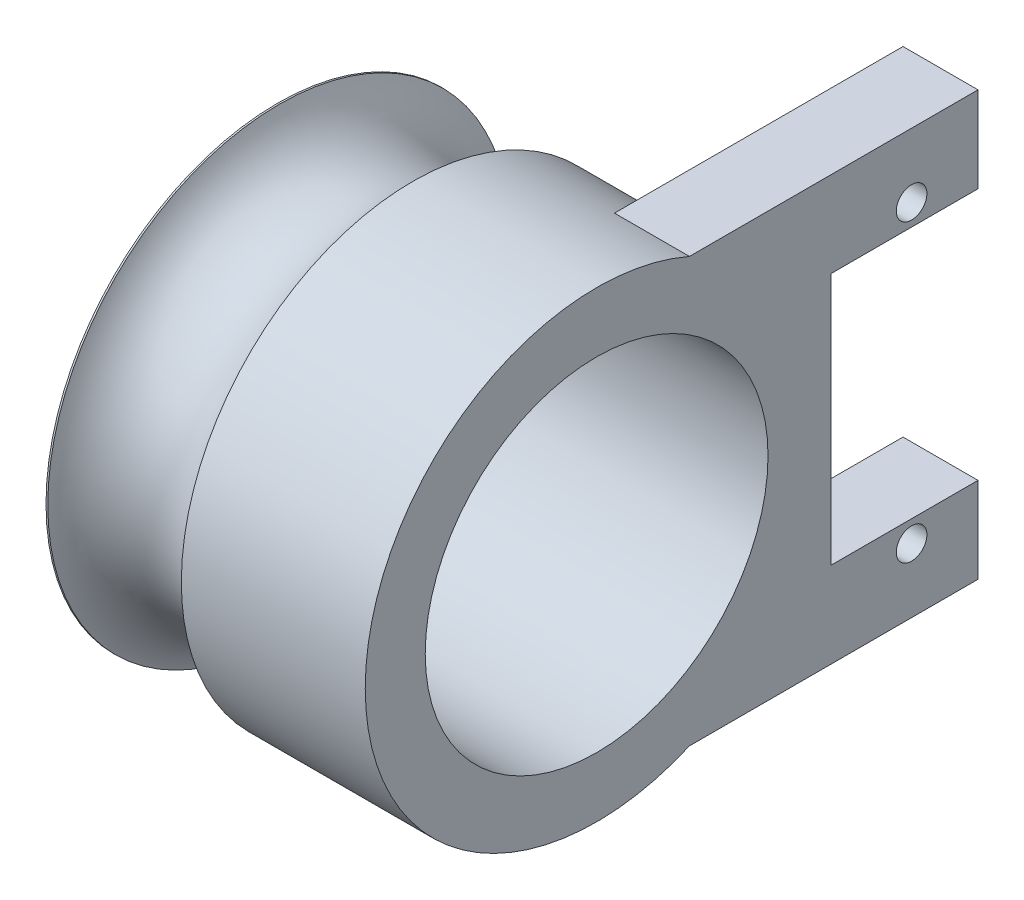
ISO-10303-21;
HEADER;
FILE_DESCRIPTION(('STEP AP214'),'2;1');
FILE_NAME('part.step','',(''),(''),'','','');
FILE_SCHEMA(('AUTOMOTIVE_DESIGN { 1 0 10303 214 1 1 1 1 }'));
ENDSEC;
DATA;
#1=APPLICATION_CONTEXT('core data for automotive mechanical design processes');
#2=APPLICATION_PROTOCOL_DEFINITION('international standard','automotive_design',2000,#1);
#3=PRODUCT_CONTEXT('',#1,'mechanical');
#4=PRODUCT('Part','Part','',(#3));
#5=PRODUCT_RELATED_PRODUCT_CATEGORY('part','',(#4));
#6=PRODUCT_DEFINITION_FORMATION('','',#4);
#7=PRODUCT_DEFINITION_CONTEXT('part definition',#1,'design');
#8=PRODUCT_DEFINITION('design','',#6,#7);
#9=PRODUCT_DEFINITION_SHAPE('','',#8);
#10=(LENGTH_UNIT() NAMED_UNIT(*) SI_UNIT(.MILLI.,.METRE.));
#11=(NAMED_UNIT(*) PLANE_ANGLE_UNIT() SI_UNIT($,.RADIAN.));
#12=(NAMED_UNIT(*) SI_UNIT($,.STERADIAN.) SOLID_ANGLE_UNIT());
#13=UNCERTAINTY_MEASURE_WITH_UNIT(LENGTH_MEASURE(1.E-05),#10,'distance_accuracy_value','');
#14=(GEOMETRIC_REPRESENTATION_CONTEXT(3) GLOBAL_UNCERTAINTY_ASSIGNED_CONTEXT((#13)) GLOBAL_UNIT_ASSIGNED_CONTEXT((#10,
#11,#12)) REPRESENTATION_CONTEXT('',''));
#15=CARTESIAN_POINT('',(0.,0.,0.));
#16=DIRECTION('',(0.,0.,1.));
#17=DIRECTION('',(1.,0.,0.));
#18=AXIS2_PLACEMENT_3D('',#15,#16,#17);
#19=CARTESIAN_POINT('',(-6.4,21.6,0.));
#20=DIRECTION('',(-1.,0.,0.));
#21=DIRECTION('',(0.,0.,1.));
#22=AXIS2_PLACEMENT_3D('',#19,#20,#21);
#23=PLANE('',#22);
#24=CARTESIAN_POINT('',(-6.4,0.,0.));
#25=DIRECTION('',(1.,0.,0.));
#26=DIRECTION('',(0.,0.,-1.));
#27=AXIS2_PLACEMENT_3D('',#24,#25,#26);
#28=CIRCLE('',#27,16.);
#29=CARTESIAN_POINT('',(-6.4,16.,0.));
#30=VERTEX_POINT('',#29);
#31=CARTESIAN_POINT('',(-6.4,-16.,0.));
#32=VERTEX_POINT('',#31);
#33=EDGE_CURVE('E53',#30,#32,#28,.T.);
#34=ORIENTED_EDGE('',*,*,#33,.T.);
#35=CARTESIAN_POINT('',(-6.4,0.,0.));
#36=DIRECTION('',(1.,0.,0.));
#37=DIRECTION('',(0.,0.,-1.));
#38=AXIS2_PLACEMENT_3D('',#35,#36,#37);
#39=CIRCLE('',#38,16.);
#40=EDGE_CURVE('E11',#32,#30,#39,.T.);
#41=ORIENTED_EDGE('',*,*,#40,.T.);
#42=EDGE_LOOP('',(#34,#41));
#43=FACE_BOUND('',#42,.T.);
#44=CARTESIAN_POINT('',(-6.4,0.,0.));
#45=DIRECTION('',(1.,0.,0.));
#46=DIRECTION('',(0.,0.,-1.));
#47=AXIS2_PLACEMENT_3D('',#44,#45,#46);
#48=CIRCLE('',#47,21.6);
#49=CARTESIAN_POINT('',(-6.4,21.6,0.));
#50=VERTEX_POINT('',#49);
#51=CARTESIAN_POINT('',(-6.4,-21.6,0.));
#52=VERTEX_POINT('',#51);
#53=EDGE_CURVE('E186',#50,#52,#48,.T.);
#54=ORIENTED_EDGE('',*,*,#53,.F.);
#55=CARTESIAN_POINT('',(-6.4,0.,0.));
#56=DIRECTION('',(1.,0.,0.));
#57=DIRECTION('',(0.,0.,-1.));
#58=AXIS2_PLACEMENT_3D('',#55,#56,#57);
#59=CIRCLE('',#58,21.6);
#60=EDGE_CURVE('E182',#52,#50,#59,.T.);
#61=ORIENTED_EDGE('',*,*,#60,.F.);
#62=EDGE_LOOP('',(#54,#61));
#63=FACE_BOUND('',#62,.T.);
#64=ADVANCED_FACE('F44',(#43,#63),#23,.T.);
#65=CARTESIAN_POINT('',(0.,0.,0.));
#66=DIRECTION('',(1.,0.,0.));
#67=DIRECTION('',(0.,1.,0.));
#68=AXIS2_PLACEMENT_3D('',#65,#66,#67);
#69=CYLINDRICAL_SURFACE('',#68,16.);
#70=DIRECTION('',(-1.,0.,0.));
#71=VECTOR('',#70,1.);
#72=CARTESIAN_POINT('',(0.,-16.,0.));
#73=LINE('',#72,#71);
#74=CARTESIAN_POINT('',(6.4,-16.,0.));
#75=VERTEX_POINT('',#74);
#76=EDGE_CURVE('E181',#75,#32,#73,.T.);
#77=ORIENTED_EDGE('',*,*,#76,.F.);
#78=ORIENTED_EDGE('',*,*,#76,.T.);
#79=ORIENTED_EDGE('',*,*,#33,.F.);
#80=ORIENTED_EDGE('',*,*,#40,.F.);
#81=EDGE_LOOP('',(#77,#78,#79,#80));
#82=FACE_BOUND('',#81,.T.);
#83=CARTESIAN_POINT('',(23.4,0.,0.));
#84=DIRECTION('',(1.,0.,0.));
#85=DIRECTION('',(0.,0.,-1.));
#86=AXIS2_PLACEMENT_3D('',#83,#84,#85);
#87=CIRCLE('',#86,16.);
#88=CARTESIAN_POINT('',(23.4,0.,-16.));
#89=VERTEX_POINT('',#88);
#90=EDGE_CURVE('E294',#89,#89,#87,.T.);
#91=ORIENTED_EDGE('',*,*,#90,.T.);
#92=EDGE_LOOP('',(#91));
#93=FACE_BOUND('',#92,.T.);
#94=ADVANCED_FACE('F220',(#82,#93),#69,.F.);
#95=CARTESIAN_POINT('',(4.8,0.,0.));
#96=DIRECTION('',(1.,0.,0.));
#97=DIRECTION('',(0.,1.,0.));
#98=AXIS2_PLACEMENT_3D('',#95,#96,#97);
#99=CYLINDRICAL_SURFACE('',#98,21.6);
#100=DIRECTION('',(-1.,0.,0.));
#101=VECTOR('',#100,1.);
#102=CARTESIAN_POINT('',(4.8,-21.6,0.));
#103=LINE('',#102,#101);
#104=CARTESIAN_POINT('',(6.4,-21.6,0.));
#105=VERTEX_POINT('',#104);
#106=CARTESIAN_POINT('',(6.23397144683869,-21.6,0.));
#107=VERTEX_POINT('',#106);
#108=EDGE_CURVE('E211',#105,#107,#103,.T.);
#109=ORIENTED_EDGE('',*,*,#108,.F.);
#110=ORIENTED_EDGE('',*,*,#108,.T.);
#111=CARTESIAN_POINT('',(6.23397144683869,0.,0.));
#112=DIRECTION('',(1.,0.,0.));
#113=DIRECTION('',(0.,1.,0.));
#114=AXIS2_PLACEMENT_3D('',#111,#112,#113);
#115=CIRCLE('',#114,21.6);
#116=CARTESIAN_POINT('',(6.23397144683869,0.,-21.6));
#117=VERTEX_POINT('',#116);
#118=EDGE_CURVE('E196',#107,#117,#115,.T.);
#119=ORIENTED_EDGE('',*,*,#118,.T.);
#120=CARTESIAN_POINT('',(6.23397144683869,0.,0.));
#121=DIRECTION('',(1.,0.,0.));
#122=DIRECTION('',(0.,1.,0.));
#123=AXIS2_PLACEMENT_3D('',#120,#121,#122);
#124=CIRCLE('',#123,21.6);
#125=EDGE_CURVE('E203',#117,#107,#124,.T.);
#126=ORIENTED_EDGE('',*,*,#125,.T.);
#127=EDGE_LOOP('',(#109,#110,#119,#126));
#128=FACE_BOUND('',#127,.T.);
#129=CARTESIAN_POINT('',(16.4,0.,0.));
#130=DIRECTION('',(1.,0.,0.));
#131=DIRECTION('',(0.,0.,-1.));
#132=AXIS2_PLACEMENT_3D('',#129,#130,#131);
#133=CIRCLE('',#132,21.6);
#134=CARTESIAN_POINT('',(16.4,-19.785999201822,-8.66453897131854));
#135=VERTEX_POINT('',#134);
#136=CARTESIAN_POINT('',(16.4,19.785999201822,-8.66453897131854));
#137=VERTEX_POINT('',#136);
#138=EDGE_CURVE('E61',#135,#137,#133,.T.);
#139=ORIENTED_EDGE('',*,*,#138,.F.);
#140=DIRECTION('',(-1.,0.,0.));
#141=VECTOR('',#140,1.);
#142=CARTESIAN_POINT('',(23.4,-19.785999201822,-8.66453897131854));
#143=LINE('',#142,#141);
#144=CARTESIAN_POINT('',(23.4,-19.785999201822,-8.66453897131854));
#145=VERTEX_POINT('',#144);
#146=EDGE_CURVE('E155',#145,#135,#143,.T.);
#147=ORIENTED_EDGE('',*,*,#146,.F.);
#148=CARTESIAN_POINT('',(23.4,0.,0.));
#149=DIRECTION('',(1.,0.,0.));
#150=DIRECTION('',(0.,0.,-1.));
#151=AXIS2_PLACEMENT_3D('',#148,#149,#150);
#152=CIRCLE('',#151,21.6);
#153=CARTESIAN_POINT('',(23.4,19.785999201822,-8.66453897131854));
#154=VERTEX_POINT('',#153);
#155=EDGE_CURVE('E161',#154,#145,#152,.T.);
#156=ORIENTED_EDGE('',*,*,#155,.F.);
#157=DIRECTION('',(-1.,0.,0.));
#158=VECTOR('',#157,1.);
#159=CARTESIAN_POINT('',(23.4,19.785999201822,-8.66453897131854));
#160=LINE('',#159,#158);
#161=EDGE_CURVE('E317',#154,#137,#160,.T.);
#162=ORIENTED_EDGE('',*,*,#161,.T.);
#163=EDGE_LOOP('',(#139,#147,#156,#162));
#164=FACE_BOUND('',#163,.T.);
#165=ADVANCED_FACE('F171',(#128,#164),#99,.T.);
#166=CARTESIAN_POINT('',(-4.8,0.,0.));
#167=DIRECTION('',(1.,0.,0.));
#168=DIRECTION('',(0.,1.,0.));
#169=AXIS2_PLACEMENT_3D('',#166,#167,#168);
#170=CYLINDRICAL_SURFACE('',#169,21.6);
#171=CARTESIAN_POINT('',(-6.23397144683867,0.,0.));
#172=DIRECTION('',(-1.,0.,0.));
#173=DIRECTION('',(0.,1.,0.));
#174=AXIS2_PLACEMENT_3D('',#171,#172,#173);
#175=CIRCLE('',#174,21.6);
#176=CARTESIAN_POINT('',(-6.23397144683867,-21.6,0.));
#177=VERTEX_POINT('',#176);
#178=CARTESIAN_POINT('',(-6.23397144683867,0.,-21.6));
#179=VERTEX_POINT('',#178);
#180=EDGE_CURVE('E173',#177,#179,#175,.T.);
#181=ORIENTED_EDGE('',*,*,#180,.T.);
#182=CARTESIAN_POINT('',(-6.23397144683867,0.,0.));
#183=DIRECTION('',(-1.,0.,0.));
#184=DIRECTION('',(0.,1.,0.));
#185=AXIS2_PLACEMENT_3D('',#182,#183,#184);
#186=CIRCLE('',#185,21.6);
#187=EDGE_CURVE('E191',#179,#177,#186,.T.);
#188=ORIENTED_EDGE('',*,*,#187,.T.);
#189=DIRECTION('',(-1.,0.,0.));
#190=VECTOR('',#189,1.);
#191=CARTESIAN_POINT('',(-4.8,-21.6,0.));
#192=LINE('',#191,#190);
#193=EDGE_CURVE('E187',#177,#52,#192,.T.);
#194=ORIENTED_EDGE('',*,*,#193,.T.);
#195=ORIENTED_EDGE('',*,*,#60,.T.);
#196=ORIENTED_EDGE('',*,*,#53,.T.);
#197=ORIENTED_EDGE('',*,*,#193,.F.);
#198=EDGE_LOOP('',(#181,#188,#194,#195,#196,#197));
#199=FACE_BOUND('',#198,.T.);
#200=ADVANCED_FACE('F226',(#199),#170,.T.);
#201=CARTESIAN_POINT('',(0.,0.,0.));
#202=DIRECTION('',(-1.,0.,0.));
#203=DIRECTION('',(0.,0.,1.));
#204=AXIS2_PLACEMENT_3D('',#201,#202,#203);
#205=TOROIDAL_SURFACE('',#204,24.,6.68);
#206=ORIENTED_EDGE('',*,*,#180,.F.);
#207=ORIENTED_EDGE('',*,*,#187,.F.);
#208=CARTESIAN_POINT('',(0.,0.,-24.));
#209=DIRECTION('',(0.,1.,0.));
#210=DIRECTION('',(0.,0.,-1.));
#211=AXIS2_PLACEMENT_3D('',#208,#209,#210);
#212=CIRCLE('',#211,6.68);
#213=EDGE_CURVE('E192',#179,#117,#212,.T.);
#214=ORIENTED_EDGE('',*,*,#213,.T.);
#215=ORIENTED_EDGE('',*,*,#118,.F.);
#216=ORIENTED_EDGE('',*,*,#125,.F.);
#217=ORIENTED_EDGE('',*,*,#213,.F.);
#218=EDGE_LOOP('',(#206,#207,#214,#215,#216,#217));
#219=FACE_BOUND('',#218,.T.);
#220=ADVANCED_FACE('F230',(#219),#205,.F.);
#221=CARTESIAN_POINT('',(16.4,0.,0.));
#222=DIRECTION('',(1.,0.,0.));
#223=DIRECTION('',(0.,0.,-1.));
#224=AXIS2_PLACEMENT_3D('',#221,#222,#223);
#225=PLANE('',#224);
#226=CARTESIAN_POINT('',(16.4,13.79,-29.4011110933735));
#227=DIRECTION('',(1.,0.,0.));
#228=DIRECTION('',(0.,0.,-1.));
#229=AXIS2_PLACEMENT_3D('',#226,#227,#228);
#230=CIRCLE('',#229,1.43);
#231=CARTESIAN_POINT('',(16.4,13.79,-30.8311110933735));
#232=VERTEX_POINT('',#231);
#233=EDGE_CURVE('E293',#232,#232,#230,.T.);
#234=ORIENTED_EDGE('',*,*,#233,.T.);
#235=EDGE_LOOP('',(#234));
#236=FACE_BOUND('',#235,.T.);
#237=CARTESIAN_POINT('',(16.4,-13.79,-29.4011110933735));
#238=DIRECTION('',(1.,0.,0.));
#239=DIRECTION('',(0.,0.,-1.));
#240=AXIS2_PLACEMENT_3D('',#237,#238,#239);
#241=CIRCLE('',#240,1.43);
#242=CARTESIAN_POINT('',(16.4,-13.79,-30.8311110933735));
#243=VERTEX_POINT('',#242);
#244=EDGE_CURVE('E296',#243,#243,#241,.T.);
#245=ORIENTED_EDGE('',*,*,#244,.T.);
#246=EDGE_LOOP('',(#245));
#247=FACE_BOUND('',#246,.T.);
#248=DIRECTION('',(0.,0.,-1.));
#249=VECTOR('',#248,1.);
#250=CARTESIAN_POINT('',(16.4,-19.785999201822,-35.6011110933735));
#251=LINE('',#250,#249);
#252=CARTESIAN_POINT('',(16.4,-19.785999201822,-35.6011110933735));
#253=VERTEX_POINT('',#252);
#254=EDGE_CURVE('E304',#135,#253,#251,.T.);
#255=ORIENTED_EDGE('',*,*,#254,.F.);
#256=ORIENTED_EDGE('',*,*,#138,.T.);
#257=DIRECTION('',(0.,0.,1.));
#258=VECTOR('',#257,1.);
#259=CARTESIAN_POINT('',(16.4,19.785999201822,-8.66453897131854));
#260=LINE('',#259,#258);
#261=CARTESIAN_POINT('',(16.4,19.785999201822,-35.6011110933735));
#262=VERTEX_POINT('',#261);
#263=EDGE_CURVE('E169',#262,#137,#260,.T.);
#264=ORIENTED_EDGE('',*,*,#263,.F.);
#265=DIRECTION('',(0.,1.,0.));
#266=VECTOR('',#265,1.);
#267=CARTESIAN_POINT('',(16.4,19.785999201822,-35.6011110933735));
#268=LINE('',#267,#266);
#269=CARTESIAN_POINT('',(16.4,11.785999201822,-35.6011110933735));
#270=VERTEX_POINT('',#269);
#271=EDGE_CURVE('E327',#270,#262,#268,.T.);
#272=ORIENTED_EDGE('',*,*,#271,.F.);
#273=DIRECTION('',(0.,0.,-1.));
#274=VECTOR('',#273,1.);
#275=CARTESIAN_POINT('',(16.4,11.785999201822,-35.6011110933735));
#276=LINE('',#275,#274);
#277=CARTESIAN_POINT('',(16.4,11.785999201822,-21.9011110933735));
#278=VERTEX_POINT('',#277);
#279=EDGE_CURVE('E325',#278,#270,#276,.T.);
#280=ORIENTED_EDGE('',*,*,#279,.F.);
#281=DIRECTION('',(0.,1.,0.));
#282=VECTOR('',#281,1.);
#283=CARTESIAN_POINT('',(16.4,-11.785999201822,-21.9011110933735));
#284=LINE('',#283,#282);
#285=CARTESIAN_POINT('',(16.4,-11.785999201822,-21.9011110933735));
#286=VERTEX_POINT('',#285);
#287=EDGE_CURVE('E323',#286,#278,#284,.T.);
#288=ORIENTED_EDGE('',*,*,#287,.F.);
#289=DIRECTION('',(0.,0.,1.));
#290=VECTOR('',#289,1.);
#291=CARTESIAN_POINT('',(16.4,-11.785999201822,-21.9011110933735));
#292=LINE('',#291,#290);
#293=CARTESIAN_POINT('',(16.4,-11.785999201822,-35.6011110933735));
#294=VERTEX_POINT('',#293);
#295=EDGE_CURVE('E321',#294,#286,#292,.T.);
#296=ORIENTED_EDGE('',*,*,#295,.F.);
#297=DIRECTION('',(0.,1.,0.));
#298=VECTOR('',#297,1.);
#299=CARTESIAN_POINT('',(16.4,-11.785999201822,-35.6011110933735));
#300=LINE('',#299,#298);
#301=EDGE_CURVE('E319',#253,#294,#300,.T.);
#302=ORIENTED_EDGE('',*,*,#301,.F.);
#303=EDGE_LOOP('',(#255,#256,#264,#272,#280,#288,#296,#302));
#304=FACE_BOUND('',#303,.T.);
#305=ADVANCED_FACE('F244',(#236,#247,#304),#225,.F.);
#306=CARTESIAN_POINT('',(23.4,0.,0.));
#307=DIRECTION('',(1.,0.,0.));
#308=DIRECTION('',(0.,0.,-1.));
#309=AXIS2_PLACEMENT_3D('',#306,#307,#308);
#310=PLANE('',#309);
#311=CARTESIAN_POINT('',(23.4,13.79,-29.4011110933735));
#312=DIRECTION('',(1.,0.,0.));
#313=DIRECTION('',(0.,0.,-1.));
#314=AXIS2_PLACEMENT_3D('',#311,#312,#313);
#315=CIRCLE('',#314,1.43);
#316=CARTESIAN_POINT('',(23.4,13.79,-30.8311110933735));
#317=VERTEX_POINT('',#316);
#318=EDGE_CURVE('E290',#317,#317,#315,.T.);
#319=ORIENTED_EDGE('',*,*,#318,.F.);
#320=EDGE_LOOP('',(#319));
#321=FACE_BOUND('',#320,.T.);
#322=ORIENTED_EDGE('',*,*,#155,.T.);
#323=DIRECTION('',(0.,0.,-1.));
#324=VECTOR('',#323,1.);
#325=CARTESIAN_POINT('',(23.4,-19.785999201822,-35.6011110933735));
#326=LINE('',#325,#324);
#327=CARTESIAN_POINT('',(23.4,-19.785999201822,-35.6011110933735));
#328=VERTEX_POINT('',#327);
#329=EDGE_CURVE('E152',#145,#328,#326,.T.);
#330=ORIENTED_EDGE('',*,*,#329,.T.);
#331=DIRECTION('',(0.,1.,0.));
#332=VECTOR('',#331,1.);
#333=CARTESIAN_POINT('',(23.4,-11.785999201822,-35.6011110933735));
#334=LINE('',#333,#332);
#335=CARTESIAN_POINT('',(23.4,-11.785999201822,-35.6011110933735));
#336=VERTEX_POINT('',#335);
#337=EDGE_CURVE('E160',#328,#336,#334,.T.);
#338=ORIENTED_EDGE('',*,*,#337,.T.);
#339=DIRECTION('',(0.,0.,1.));
#340=VECTOR('',#339,1.);
#341=CARTESIAN_POINT('',(23.4,-11.785999201822,-21.9011110933735));
#342=LINE('',#341,#340);
#343=CARTESIAN_POINT('',(23.4,-11.785999201822,-21.9011110933735));
#344=VERTEX_POINT('',#343);
#345=EDGE_CURVE('E308',#336,#344,#342,.T.);
#346=ORIENTED_EDGE('',*,*,#345,.T.);
#347=DIRECTION('',(0.,1.,0.));
#348=VECTOR('',#347,1.);
#349=CARTESIAN_POINT('',(23.4,-11.785999201822,-21.9011110933735));
#350=LINE('',#349,#348);
#351=CARTESIAN_POINT('',(23.4,11.785999201822,-21.9011110933735));
#352=VERTEX_POINT('',#351);
#353=EDGE_CURVE('E310',#344,#352,#350,.T.);
#354=ORIENTED_EDGE('',*,*,#353,.T.);
#355=DIRECTION('',(0.,0.,-1.));
#356=VECTOR('',#355,1.);
#357=CARTESIAN_POINT('',(23.4,11.785999201822,-35.6011110933735));
#358=LINE('',#357,#356);
#359=CARTESIAN_POINT('',(23.4,11.785999201822,-35.6011110933735));
#360=VERTEX_POINT('',#359);
#361=EDGE_CURVE('E312',#352,#360,#358,.T.);
#362=ORIENTED_EDGE('',*,*,#361,.T.);
#363=DIRECTION('',(0.,1.,0.));
#364=VECTOR('',#363,1.);
#365=CARTESIAN_POINT('',(23.4,19.785999201822,-35.6011110933735));
#366=LINE('',#365,#364);
#367=CARTESIAN_POINT('',(23.4,19.785999201822,-35.6011110933735));
#368=VERTEX_POINT('',#367);
#369=EDGE_CURVE('E314',#360,#368,#366,.T.);
#370=ORIENTED_EDGE('',*,*,#369,.T.);
#371=DIRECTION('',(0.,0.,1.));
#372=VECTOR('',#371,1.);
#373=CARTESIAN_POINT('',(23.4,19.785999201822,-8.66453897131854));
#374=LINE('',#373,#372);
#375=EDGE_CURVE('E167',#368,#154,#374,.T.);
#376=ORIENTED_EDGE('',*,*,#375,.T.);
#377=EDGE_LOOP('',(#322,#330,#338,#346,#354,#362,#370,#376));
#378=FACE_BOUND('',#377,.T.);
#379=CARTESIAN_POINT('',(23.4,-13.79,-29.4011110933735));
#380=DIRECTION('',(1.,0.,0.));
#381=DIRECTION('',(0.,0.,-1.));
#382=AXIS2_PLACEMENT_3D('',#379,#380,#381);
#383=CIRCLE('',#382,1.43);
#384=CARTESIAN_POINT('',(23.4,-13.79,-30.8311110933735));
#385=VERTEX_POINT('',#384);
#386=EDGE_CURVE('E301',#385,#385,#383,.T.);
#387=ORIENTED_EDGE('',*,*,#386,.F.);
#388=EDGE_LOOP('',(#387));
#389=FACE_BOUND('',#388,.T.);
#390=ORIENTED_EDGE('',*,*,#90,.F.);
#391=EDGE_LOOP('',(#390));
#392=FACE_BOUND('',#391,.T.);
#393=ADVANCED_FACE('F164',(#321,#378,#389,#392),#310,.T.);
#394=CARTESIAN_POINT('',(23.4,-19.785999201822,-35.6011110933735));
#395=DIRECTION('',(0.,1.,0.));
#396=DIRECTION('',(0.,0.,1.));
#397=AXIS2_PLACEMENT_3D('',#394,#395,#396);
#398=PLANE('',#397);
#399=ORIENTED_EDGE('',*,*,#254,.T.);
#400=DIRECTION('',(-1.,0.,0.));
#401=VECTOR('',#400,1.);
#402=CARTESIAN_POINT('',(23.4,-19.785999201822,-35.6011110933735));
#403=LINE('',#402,#401);
#404=EDGE_CURVE('E157',#328,#253,#403,.T.);
#405=ORIENTED_EDGE('',*,*,#404,.F.);
#406=ORIENTED_EDGE('',*,*,#329,.F.);
#407=ORIENTED_EDGE('',*,*,#146,.T.);
#408=EDGE_LOOP('',(#399,#405,#406,#407));
#409=FACE_BOUND('',#408,.T.);
#410=ADVANCED_FACE('F154',(#409),#398,.F.);
#411=CARTESIAN_POINT('',(23.4,-11.785999201822,-35.6011110933735));
#412=DIRECTION('',(0.,0.,1.));
#413=DIRECTION('',(1.,0.,0.));
#414=AXIS2_PLACEMENT_3D('',#411,#412,#413);
#415=PLANE('',#414);
#416=ORIENTED_EDGE('',*,*,#301,.T.);
#417=DIRECTION('',(-1.,0.,0.));
#418=VECTOR('',#417,1.);
#419=CARTESIAN_POINT('',(23.4,-11.785999201822,-35.6011110933735));
#420=LINE('',#419,#418);
#421=EDGE_CURVE('E175',#336,#294,#420,.T.);
#422=ORIENTED_EDGE('',*,*,#421,.F.);
#423=ORIENTED_EDGE('',*,*,#337,.F.);
#424=ORIENTED_EDGE('',*,*,#404,.T.);
#425=EDGE_LOOP('',(#416,#422,#423,#424));
#426=FACE_BOUND('',#425,.T.);
#427=ADVANCED_FACE('F247',(#426),#415,.F.);
#428=CARTESIAN_POINT('',(23.4,-11.785999201822,-21.9011110933735));
#429=DIRECTION('',(0.,-1.,0.));
#430=DIRECTION('',(0.,0.,-1.));
#431=AXIS2_PLACEMENT_3D('',#428,#429,#430);
#432=PLANE('',#431);
#433=ORIENTED_EDGE('',*,*,#295,.T.);
#434=DIRECTION('',(-1.,0.,0.));
#435=VECTOR('',#434,1.);
#436=CARTESIAN_POINT('',(23.4,-11.785999201822,-21.9011110933735));
#437=LINE('',#436,#435);
#438=EDGE_CURVE('E341',#344,#286,#437,.T.);
#439=ORIENTED_EDGE('',*,*,#438,.F.);
#440=ORIENTED_EDGE('',*,*,#345,.F.);
#441=ORIENTED_EDGE('',*,*,#421,.T.);
#442=EDGE_LOOP('',(#433,#439,#440,#441));
#443=FACE_BOUND('',#442,.T.);
#444=ADVANCED_FACE('F250',(#443),#432,.F.);
#445=CARTESIAN_POINT('',(23.4,-11.785999201822,-21.9011110933735));
#446=DIRECTION('',(0.,0.,1.));
#447=DIRECTION('',(1.,0.,0.));
#448=AXIS2_PLACEMENT_3D('',#445,#446,#447);
#449=PLANE('',#448);
#450=ORIENTED_EDGE('',*,*,#287,.T.);
#451=DIRECTION('',(-1.,0.,0.));
#452=VECTOR('',#451,1.);
#453=CARTESIAN_POINT('',(23.4,11.785999201822,-21.9011110933735));
#454=LINE('',#453,#452);
#455=EDGE_CURVE('E338',#352,#278,#454,.T.);
#456=ORIENTED_EDGE('',*,*,#455,.F.);
#457=ORIENTED_EDGE('',*,*,#353,.F.);
#458=ORIENTED_EDGE('',*,*,#438,.T.);
#459=EDGE_LOOP('',(#450,#456,#457,#458));
#460=FACE_BOUND('',#459,.T.);
#461=ADVANCED_FACE('F254',(#460),#449,.F.);
#462=CARTESIAN_POINT('',(23.4,11.785999201822,-35.6011110933735));
#463=DIRECTION('',(0.,1.,0.));
#464=DIRECTION('',(0.,0.,1.));
#465=AXIS2_PLACEMENT_3D('',#462,#463,#464);
#466=PLANE('',#465);
#467=ORIENTED_EDGE('',*,*,#279,.T.);
#468=DIRECTION('',(-1.,0.,0.));
#469=VECTOR('',#468,1.);
#470=CARTESIAN_POINT('',(23.4,11.785999201822,-35.6011110933735));
#471=LINE('',#470,#469);
#472=EDGE_CURVE('E335',#360,#270,#471,.T.);
#473=ORIENTED_EDGE('',*,*,#472,.F.);
#474=ORIENTED_EDGE('',*,*,#361,.F.);
#475=ORIENTED_EDGE('',*,*,#455,.T.);
#476=EDGE_LOOP('',(#467,#473,#474,#475));
#477=FACE_BOUND('',#476,.T.);
#478=ADVANCED_FACE('F258',(#477),#466,.F.);
#479=CARTESIAN_POINT('',(23.4,19.785999201822,-35.6011110933735));
#480=DIRECTION('',(0.,0.,1.));
#481=DIRECTION('',(1.,0.,0.));
#482=AXIS2_PLACEMENT_3D('',#479,#480,#481);
#483=PLANE('',#482);
#484=ORIENTED_EDGE('',*,*,#271,.T.);
#485=DIRECTION('',(-1.,0.,0.));
#486=VECTOR('',#485,1.);
#487=CARTESIAN_POINT('',(23.4,19.785999201822,-35.6011110933735));
#488=LINE('',#487,#486);
#489=EDGE_CURVE('E332',#368,#262,#488,.T.);
#490=ORIENTED_EDGE('',*,*,#489,.F.);
#491=ORIENTED_EDGE('',*,*,#369,.F.);
#492=ORIENTED_EDGE('',*,*,#472,.T.);
#493=EDGE_LOOP('',(#484,#490,#491,#492));
#494=FACE_BOUND('',#493,.T.);
#495=ADVANCED_FACE('F262',(#494),#483,.F.);
#496=CARTESIAN_POINT('',(23.4,19.785999201822,-8.66453897131854));
#497=DIRECTION('',(0.,-1.,0.));
#498=DIRECTION('',(0.,0.,-1.));
#499=AXIS2_PLACEMENT_3D('',#496,#497,#498);
#500=PLANE('',#499);
#501=ORIENTED_EDGE('',*,*,#263,.T.);
#502=ORIENTED_EDGE('',*,*,#161,.F.);
#503=ORIENTED_EDGE('',*,*,#375,.F.);
#504=ORIENTED_EDGE('',*,*,#489,.T.);
#505=EDGE_LOOP('',(#501,#502,#503,#504));
#506=FACE_BOUND('',#505,.T.);
#507=ADVANCED_FACE('F266',(#506),#500,.F.);
#508=CARTESIAN_POINT('',(23.4,-13.79,-29.4011110933735));
#509=DIRECTION('',(-1.,0.,0.));
#510=DIRECTION('',(0.,0.,1.));
#511=AXIS2_PLACEMENT_3D('',#508,#509,#510);
#512=CYLINDRICAL_SURFACE('',#511,1.43);
#513=ORIENTED_EDGE('',*,*,#386,.T.);
#514=EDGE_LOOP('',(#513));
#515=FACE_BOUND('',#514,.T.);
#516=ORIENTED_EDGE('',*,*,#244,.F.);
#517=EDGE_LOOP('',(#516));
#518=FACE_BOUND('',#517,.T.);
#519=ADVANCED_FACE('F270',(#515,#518),#512,.F.);
#520=CARTESIAN_POINT('',(23.4,13.79,-29.4011110933735));
#521=DIRECTION('',(-1.,0.,0.));
#522=DIRECTION('',(0.,0.,1.));
#523=AXIS2_PLACEMENT_3D('',#520,#521,#522);
#524=CYLINDRICAL_SURFACE('',#523,1.43);
#525=ORIENTED_EDGE('',*,*,#318,.T.);
#526=EDGE_LOOP('',(#525));
#527=FACE_BOUND('',#526,.T.);
#528=ORIENTED_EDGE('',*,*,#233,.F.);
#529=EDGE_LOOP('',(#528));
#530=FACE_BOUND('',#529,.T.);
#531=ADVANCED_FACE('F280',(#527,#530),#524,.F.);
#532=CLOSED_SHELL('',(#64,#94,#165,#200,#220,#305,#393,#410,#427,#444,#461,#478,#495,#507,#519,#531));
#533=MANIFOLD_SOLID_BREP('B2',#532);
#534=ADVANCED_BREP_SHAPE_REPRESENTATION('',(#18,#533),#14);
#535=SHAPE_DEFINITION_REPRESENTATION(#9,#534);
ENDSEC;
END-ISO-10303-21;
